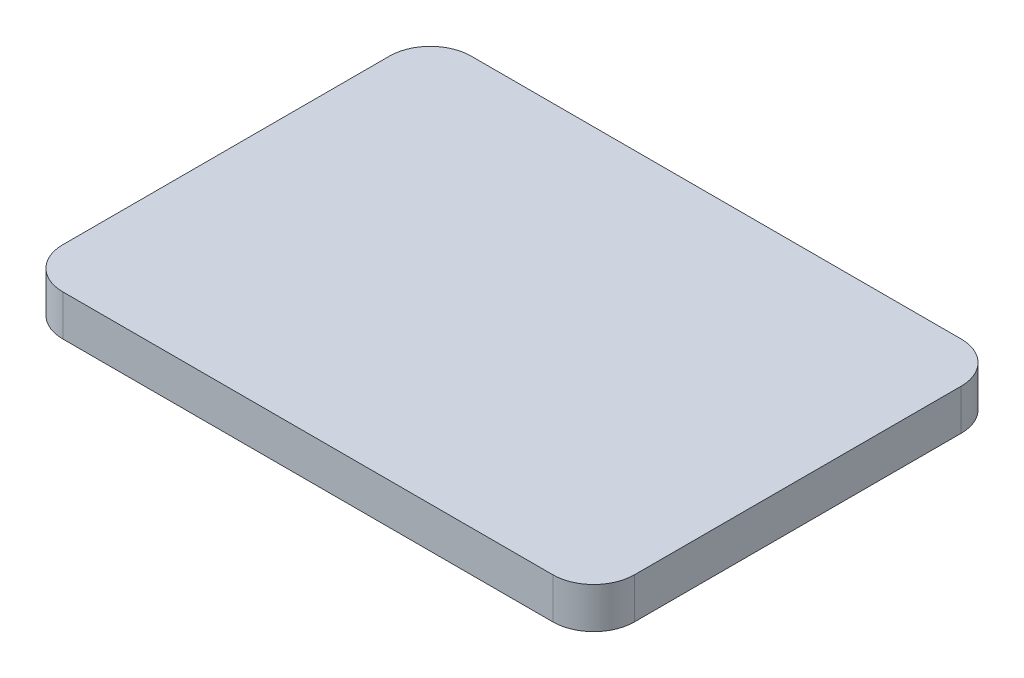
ISO-10303-21;
HEADER;
FILE_DESCRIPTION(('STEP AP214'),'2;1');
FILE_NAME('part.step','',(''),(''),'','','');
FILE_SCHEMA(('AUTOMOTIVE_DESIGN { 1 0 10303 214 1 1 1 1 }'));
ENDSEC;
DATA;
#1=APPLICATION_CONTEXT('core data for automotive mechanical design processes');
#2=APPLICATION_PROTOCOL_DEFINITION('international standard','automotive_design',2000,#1);
#3=PRODUCT_CONTEXT('',#1,'mechanical');
#4=PRODUCT('Part','Part','',(#3));
#5=PRODUCT_RELATED_PRODUCT_CATEGORY('part','',(#4));
#6=PRODUCT_DEFINITION_FORMATION('','',#4);
#7=PRODUCT_DEFINITION_CONTEXT('part definition',#1,'design');
#8=PRODUCT_DEFINITION('design','',#6,#7);
#9=PRODUCT_DEFINITION_SHAPE('','',#8);
#10=(LENGTH_UNIT() NAMED_UNIT(*) SI_UNIT(.MILLI.,.METRE.));
#11=(NAMED_UNIT(*) PLANE_ANGLE_UNIT() SI_UNIT($,.RADIAN.));
#12=(NAMED_UNIT(*) SI_UNIT($,.STERADIAN.) SOLID_ANGLE_UNIT());
#13=UNCERTAINTY_MEASURE_WITH_UNIT(LENGTH_MEASURE(1.E-05),#10,'distance_accuracy_value','');
#14=(GEOMETRIC_REPRESENTATION_CONTEXT(3) GLOBAL_UNCERTAINTY_ASSIGNED_CONTEXT((#13)) GLOBAL_UNIT_ASSIGNED_CONTEXT((#10,
#11,#12)) REPRESENTATION_CONTEXT('',''));
#15=CARTESIAN_POINT('',(0.,0.,0.));
#16=DIRECTION('',(0.,0.,1.));
#17=DIRECTION('',(1.,0.,0.));
#18=AXIS2_PLACEMENT_3D('',#15,#16,#17);
#19=CARTESIAN_POINT('',(65.,5.,-45.));
#20=DIRECTION('',(0.,-1.,0.));
#21=DIRECTION('',(0.,0.,-1.));
#22=AXIS2_PLACEMENT_3D('',#19,#20,#21);
#23=CYLINDRICAL_SURFACE('',#22,5.);
#24=CARTESIAN_POINT('',(65.,0.,-45.));
#25=DIRECTION('',(0.,1.,0.));
#26=DIRECTION('',(0.,0.,-1.));
#27=AXIS2_PLACEMENT_3D('',#24,#25,#26);
#28=CIRCLE('',#27,5.);
#29=CARTESIAN_POINT('',(70.,0.,-45.));
#30=VERTEX_POINT('',#29);
#31=CARTESIAN_POINT('',(65.,0.,-50.));
#32=VERTEX_POINT('',#31);
#33=EDGE_CURVE('E129',#30,#32,#28,.T.);
#34=ORIENTED_EDGE('',*,*,#33,.T.);
#35=DIRECTION('',(0.,-1.,0.));
#36=VECTOR('',#35,1.);
#37=CARTESIAN_POINT('',(65.,5.,-50.));
#38=LINE('',#37,#36);
#39=CARTESIAN_POINT('',(65.,5.,-50.));
#40=VERTEX_POINT('',#39);
#41=EDGE_CURVE('E11',#40,#32,#38,.T.);
#42=ORIENTED_EDGE('',*,*,#41,.F.);
#43=CARTESIAN_POINT('',(65.,5.,-45.));
#44=DIRECTION('',(0.,1.,0.));
#45=DIRECTION('',(0.,0.,-1.));
#46=AXIS2_PLACEMENT_3D('',#43,#44,#45);
#47=CIRCLE('',#46,5.);
#48=CARTESIAN_POINT('',(70.,5.,-45.));
#49=VERTEX_POINT('',#48);
#50=EDGE_CURVE('E143',#49,#40,#47,.T.);
#51=ORIENTED_EDGE('',*,*,#50,.F.);
#52=DIRECTION('',(0.,-1.,0.));
#53=VECTOR('',#52,1.);
#54=CARTESIAN_POINT('',(70.,5.,-45.));
#55=LINE('',#54,#53);
#56=EDGE_CURVE('E125',#49,#30,#55,.T.);
#57=ORIENTED_EDGE('',*,*,#56,.T.);
#58=EDGE_LOOP('',(#34,#42,#51,#57));
#59=FACE_BOUND('',#58,.T.);
#60=ADVANCED_FACE('F33',(#59),#23,.T.);
#61=CARTESIAN_POINT('',(5.,5.,-50.));
#62=DIRECTION('',(0.,0.,1.));
#63=DIRECTION('',(1.,0.,0.));
#64=AXIS2_PLACEMENT_3D('',#61,#62,#63);
#65=PLANE('',#64);
#66=DIRECTION('',(-1.,0.,0.));
#67=VECTOR('',#66,1.);
#68=CARTESIAN_POINT('',(5.,0.,-50.));
#69=LINE('',#68,#67);
#70=CARTESIAN_POINT('',(5.,0.,-50.));
#71=VERTEX_POINT('',#70);
#72=EDGE_CURVE('E132',#32,#71,#69,.T.);
#73=ORIENTED_EDGE('',*,*,#72,.T.);
#74=DIRECTION('',(0.,-1.,0.));
#75=VECTOR('',#74,1.);
#76=CARTESIAN_POINT('',(5.,5.,-50.));
#77=LINE('',#76,#75);
#78=CARTESIAN_POINT('',(5.,5.,-50.));
#79=VERTEX_POINT('',#78);
#80=EDGE_CURVE('E41',#79,#71,#77,.T.);
#81=ORIENTED_EDGE('',*,*,#80,.F.);
#82=DIRECTION('',(-1.,0.,0.));
#83=VECTOR('',#82,1.);
#84=CARTESIAN_POINT('',(5.,5.,-50.));
#85=LINE('',#84,#83);
#86=EDGE_CURVE('E92',#40,#79,#85,.T.);
#87=ORIENTED_EDGE('',*,*,#86,.F.);
#88=ORIENTED_EDGE('',*,*,#41,.T.);
#89=EDGE_LOOP('',(#73,#81,#87,#88));
#90=FACE_BOUND('',#89,.T.);
#91=ADVANCED_FACE('F178',(#90),#65,.F.);
#92=CARTESIAN_POINT('',(5.,5.,-45.));
#93=DIRECTION('',(0.,-1.,0.));
#94=DIRECTION('',(0.,0.,-1.));
#95=AXIS2_PLACEMENT_3D('',#92,#93,#94);
#96=CYLINDRICAL_SURFACE('',#95,5.);
#97=CARTESIAN_POINT('',(5.,0.,-45.));
#98=DIRECTION('',(0.,1.,0.));
#99=DIRECTION('',(0.,0.,-1.));
#100=AXIS2_PLACEMENT_3D('',#97,#98,#99);
#101=CIRCLE('',#100,5.);
#102=CARTESIAN_POINT('',(0.,0.,-45.));
#103=VERTEX_POINT('',#102);
#104=EDGE_CURVE('E134',#71,#103,#101,.T.);
#105=ORIENTED_EDGE('',*,*,#104,.T.);
#106=DIRECTION('',(0.,-1.,0.));
#107=VECTOR('',#106,1.);
#108=CARTESIAN_POINT('',(0.,5.,-45.));
#109=LINE('',#108,#107);
#110=CARTESIAN_POINT('',(0.,5.,-45.));
#111=VERTEX_POINT('',#110);
#112=EDGE_CURVE('E150',#111,#103,#109,.T.);
#113=ORIENTED_EDGE('',*,*,#112,.F.);
#114=CARTESIAN_POINT('',(5.,5.,-45.));
#115=DIRECTION('',(0.,1.,0.));
#116=DIRECTION('',(0.,0.,-1.));
#117=AXIS2_PLACEMENT_3D('',#114,#115,#116);
#118=CIRCLE('',#117,5.);
#119=EDGE_CURVE('E158',#79,#111,#118,.T.);
#120=ORIENTED_EDGE('',*,*,#119,.F.);
#121=ORIENTED_EDGE('',*,*,#80,.T.);
#122=EDGE_LOOP('',(#105,#113,#120,#121));
#123=FACE_BOUND('',#122,.T.);
#124=ADVANCED_FACE('F156',(#123),#96,.T.);
#125=CARTESIAN_POINT('',(0.,5.,-5.00000000000004));
#126=DIRECTION('',(1.,0.,0.));
#127=DIRECTION('',(0.,0.,-1.));
#128=AXIS2_PLACEMENT_3D('',#125,#126,#127);
#129=PLANE('',#128);
#130=DIRECTION('',(0.,0.,1.));
#131=VECTOR('',#130,1.);
#132=CARTESIAN_POINT('',(0.,0.,-5.00000000000004));
#133=LINE('',#132,#131);
#134=CARTESIAN_POINT('',(0.,0.,-5.00000000000004));
#135=VERTEX_POINT('',#134);
#136=EDGE_CURVE('E136',#103,#135,#133,.T.);
#137=ORIENTED_EDGE('',*,*,#136,.T.);
#138=DIRECTION('',(0.,-1.,0.));
#139=VECTOR('',#138,1.);
#140=CARTESIAN_POINT('',(0.,5.,-5.00000000000004));
#141=LINE('',#140,#139);
#142=CARTESIAN_POINT('',(0.,5.,-5.00000000000004));
#143=VERTEX_POINT('',#142);
#144=EDGE_CURVE('E147',#143,#135,#141,.T.);
#145=ORIENTED_EDGE('',*,*,#144,.F.);
#146=DIRECTION('',(0.,0.,1.));
#147=VECTOR('',#146,1.);
#148=CARTESIAN_POINT('',(0.,5.,-5.00000000000004));
#149=LINE('',#148,#147);
#150=EDGE_CURVE('E170',#111,#143,#149,.T.);
#151=ORIENTED_EDGE('',*,*,#150,.F.);
#152=ORIENTED_EDGE('',*,*,#112,.T.);
#153=EDGE_LOOP('',(#137,#145,#151,#152));
#154=FACE_BOUND('',#153,.T.);
#155=ADVANCED_FACE('F166',(#154),#129,.F.);
#156=CARTESIAN_POINT('',(5.,5.,-5.));
#157=DIRECTION('',(0.,-1.,0.));
#158=DIRECTION('',(0.,0.,-1.));
#159=AXIS2_PLACEMENT_3D('',#156,#157,#158);
#160=CYLINDRICAL_SURFACE('',#159,5.);
#161=CARTESIAN_POINT('',(5.,0.,-5.));
#162=DIRECTION('',(0.,1.,0.));
#163=DIRECTION('',(0.,0.,-1.));
#164=AXIS2_PLACEMENT_3D('',#161,#162,#163);
#165=CIRCLE('',#164,5.);
#166=CARTESIAN_POINT('',(5.00000000000004,0.,0.));
#167=VERTEX_POINT('',#166);
#168=EDGE_CURVE('E138',#135,#167,#165,.T.);
#169=ORIENTED_EDGE('',*,*,#168,.T.);
#170=DIRECTION('',(0.,-1.,0.));
#171=VECTOR('',#170,1.);
#172=CARTESIAN_POINT('',(5.00000000000004,5.,0.));
#173=LINE('',#172,#171);
#174=CARTESIAN_POINT('',(5.00000000000004,5.,0.));
#175=VERTEX_POINT('',#174);
#176=EDGE_CURVE('E120',#175,#167,#173,.T.);
#177=ORIENTED_EDGE('',*,*,#176,.F.);
#178=CARTESIAN_POINT('',(5.,5.,-5.));
#179=DIRECTION('',(0.,1.,0.));
#180=DIRECTION('',(0.,0.,-1.));
#181=AXIS2_PLACEMENT_3D('',#178,#179,#180);
#182=CIRCLE('',#181,5.);
#183=EDGE_CURVE('E111',#143,#175,#182,.T.);
#184=ORIENTED_EDGE('',*,*,#183,.F.);
#185=ORIENTED_EDGE('',*,*,#144,.T.);
#186=EDGE_LOOP('',(#169,#177,#184,#185));
#187=FACE_BOUND('',#186,.T.);
#188=ADVANCED_FACE('F169',(#187),#160,.T.);
#189=CARTESIAN_POINT('',(5.00000000000004,5.,0.));
#190=DIRECTION('',(0.,0.,-1.));
#191=DIRECTION('',(-1.,0.,0.));
#192=AXIS2_PLACEMENT_3D('',#189,#190,#191);
#193=PLANE('',#192);
#194=DIRECTION('',(1.,0.,0.));
#195=VECTOR('',#194,1.);
#196=CARTESIAN_POINT('',(5.00000000000004,0.,0.));
#197=LINE('',#196,#195);
#198=CARTESIAN_POINT('',(65.,0.,0.));
#199=VERTEX_POINT('',#198);
#200=EDGE_CURVE('E119',#167,#199,#197,.T.);
#201=ORIENTED_EDGE('',*,*,#200,.T.);
#202=DIRECTION('',(0.,-1.,0.));
#203=VECTOR('',#202,1.);
#204=CARTESIAN_POINT('',(65.,5.,0.));
#205=LINE('',#204,#203);
#206=CARTESIAN_POINT('',(65.,5.,0.));
#207=VERTEX_POINT('',#206);
#208=EDGE_CURVE('E116',#207,#199,#205,.T.);
#209=ORIENTED_EDGE('',*,*,#208,.F.);
#210=DIRECTION('',(1.,0.,0.));
#211=VECTOR('',#210,1.);
#212=CARTESIAN_POINT('',(5.00000000000004,5.,0.));
#213=LINE('',#212,#211);
#214=EDGE_CURVE('E105',#175,#207,#213,.T.);
#215=ORIENTED_EDGE('',*,*,#214,.F.);
#216=ORIENTED_EDGE('',*,*,#176,.T.);
#217=EDGE_LOOP('',(#201,#209,#215,#216));
#218=FACE_BOUND('',#217,.T.);
#219=ADVANCED_FACE('F117',(#218),#193,.F.);
#220=CARTESIAN_POINT('',(65.,5.,-5.));
#221=DIRECTION('',(0.,-1.,0.));
#222=DIRECTION('',(0.,0.,-1.));
#223=AXIS2_PLACEMENT_3D('',#220,#221,#222);
#224=CYLINDRICAL_SURFACE('',#223,5.);
#225=CARTESIAN_POINT('',(65.,0.,-5.));
#226=DIRECTION('',(0.,1.,0.));
#227=DIRECTION('',(0.,0.,1.));
#228=AXIS2_PLACEMENT_3D('',#225,#226,#227);
#229=CIRCLE('',#228,5.);
#230=CARTESIAN_POINT('',(70.,0.,-5.));
#231=VERTEX_POINT('',#230);
#232=EDGE_CURVE('E78',#199,#231,#229,.T.);
#233=ORIENTED_EDGE('',*,*,#232,.T.);
#234=DIRECTION('',(0.,-1.,0.));
#235=VECTOR('',#234,1.);
#236=CARTESIAN_POINT('',(70.,5.,-5.));
#237=LINE('',#236,#235);
#238=CARTESIAN_POINT('',(70.,5.,-5.));
#239=VERTEX_POINT('',#238);
#240=EDGE_CURVE('E121',#239,#231,#237,.T.);
#241=ORIENTED_EDGE('',*,*,#240,.F.);
#242=CARTESIAN_POINT('',(65.,5.,-5.));
#243=DIRECTION('',(0.,1.,0.));
#244=DIRECTION('',(0.,0.,1.));
#245=AXIS2_PLACEMENT_3D('',#242,#243,#244);
#246=CIRCLE('',#245,5.);
#247=EDGE_CURVE('E109',#207,#239,#246,.T.);
#248=ORIENTED_EDGE('',*,*,#247,.F.);
#249=ORIENTED_EDGE('',*,*,#208,.T.);
#250=EDGE_LOOP('',(#233,#241,#248,#249));
#251=FACE_BOUND('',#250,.T.);
#252=ADVANCED_FACE('F123',(#251),#224,.T.);
#253=CARTESIAN_POINT('',(70.,5.,-5.));
#254=DIRECTION('',(-1.,0.,0.));
#255=DIRECTION('',(0.,0.,1.));
#256=AXIS2_PLACEMENT_3D('',#253,#254,#255);
#257=PLANE('',#256);
#258=DIRECTION('',(0.,0.,-1.));
#259=VECTOR('',#258,1.);
#260=CARTESIAN_POINT('',(70.,0.,-5.));
#261=LINE('',#260,#259);
#262=EDGE_CURVE('E84',#231,#30,#261,.T.);
#263=ORIENTED_EDGE('',*,*,#262,.T.);
#264=ORIENTED_EDGE('',*,*,#56,.F.);
#265=DIRECTION('',(0.,0.,-1.));
#266=VECTOR('',#265,1.);
#267=CARTESIAN_POINT('',(70.,5.,-5.));
#268=LINE('',#267,#266);
#269=EDGE_CURVE('E49',#239,#49,#268,.T.);
#270=ORIENTED_EDGE('',*,*,#269,.F.);
#271=ORIENTED_EDGE('',*,*,#240,.T.);
#272=EDGE_LOOP('',(#263,#264,#270,#271));
#273=FACE_BOUND('',#272,.T.);
#274=ADVANCED_FACE('F194',(#273),#257,.F.);
#275=CARTESIAN_POINT('',(65.,5.,-45.));
#276=DIRECTION('',(0.,-1.,0.));
#277=DIRECTION('',(0.,0.,-1.));
#278=AXIS2_PLACEMENT_3D('',#275,#276,#277);
#279=PLANE('',#278);
#280=ORIENTED_EDGE('',*,*,#50,.T.);
#281=ORIENTED_EDGE('',*,*,#86,.T.);
#282=ORIENTED_EDGE('',*,*,#119,.T.);
#283=ORIENTED_EDGE('',*,*,#150,.T.);
#284=ORIENTED_EDGE('',*,*,#183,.T.);
#285=ORIENTED_EDGE('',*,*,#214,.T.);
#286=ORIENTED_EDGE('',*,*,#247,.T.);
#287=ORIENTED_EDGE('',*,*,#269,.T.);
#288=EDGE_LOOP('',(#280,#281,#282,#283,#284,#285,#286,#287));
#289=FACE_BOUND('',#288,.T.);
#290=ADVANCED_FACE('F107',(#289),#279,.F.);
#291=CARTESIAN_POINT('',(65.,0.,-45.));
#292=DIRECTION('',(0.,-1.,0.));
#293=DIRECTION('',(0.,0.,-1.));
#294=AXIS2_PLACEMENT_3D('',#291,#292,#293);
#295=PLANE('',#294);
#296=ORIENTED_EDGE('',*,*,#33,.F.);
#297=ORIENTED_EDGE('',*,*,#262,.F.);
#298=ORIENTED_EDGE('',*,*,#232,.F.);
#299=ORIENTED_EDGE('',*,*,#200,.F.);
#300=ORIENTED_EDGE('',*,*,#168,.F.);
#301=ORIENTED_EDGE('',*,*,#136,.F.);
#302=ORIENTED_EDGE('',*,*,#104,.F.);
#303=ORIENTED_EDGE('',*,*,#72,.F.);
#304=EDGE_LOOP('',(#296,#297,#298,#299,#300,#301,#302,#303));
#305=FACE_BOUND('',#304,.T.);
#306=ADVANCED_FACE('F162',(#305),#295,.T.);
#307=CLOSED_SHELL('',(#60,#91,#124,#155,#188,#219,#252,#274,#290,#306));
#308=MANIFOLD_SOLID_BREP('B2',#307);
#309=ADVANCED_BREP_SHAPE_REPRESENTATION('',(#18,#308),#14);
#310=SHAPE_DEFINITION_REPRESENTATION(#9,#309);
ENDSEC;
END-ISO-10303-21;
